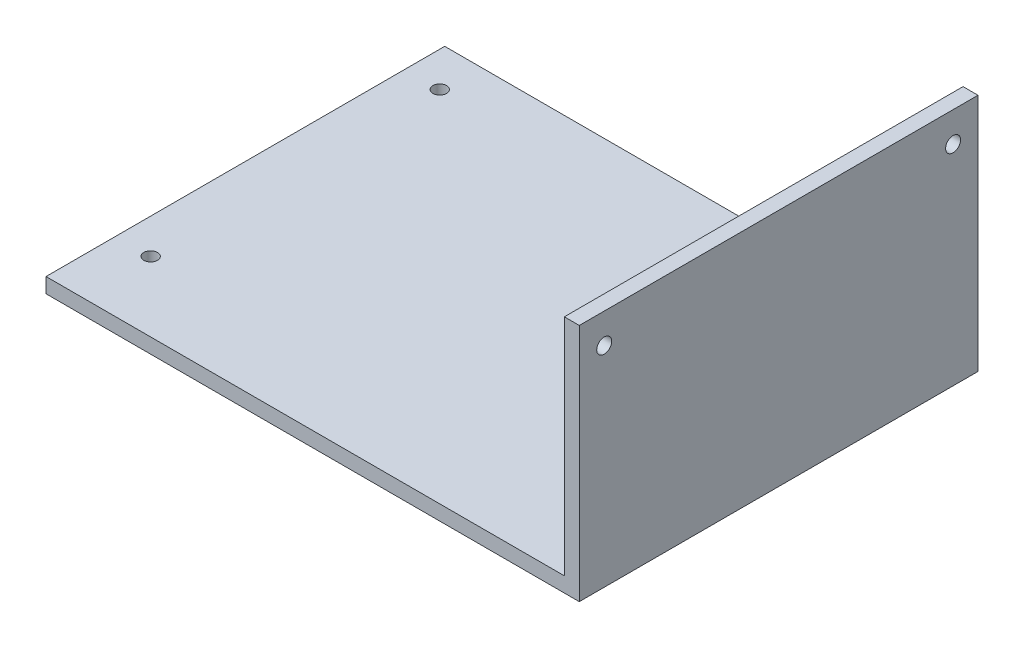
ISO-10303-21;
HEADER;
FILE_DESCRIPTION(('STEP AP214'),'2;1');
FILE_NAME('part.step','',(''),(''),'','','');
FILE_SCHEMA(('AUTOMOTIVE_DESIGN { 1 0 10303 214 1 1 1 1 }'));
ENDSEC;
DATA;
#1=APPLICATION_CONTEXT('core data for automotive mechanical design processes');
#2=APPLICATION_PROTOCOL_DEFINITION('international standard','automotive_design',2000,#1);
#3=PRODUCT_CONTEXT('',#1,'mechanical');
#4=PRODUCT('Part','Part','',(#3));
#5=PRODUCT_RELATED_PRODUCT_CATEGORY('part','',(#4));
#6=PRODUCT_DEFINITION_FORMATION('','',#4);
#7=PRODUCT_DEFINITION_CONTEXT('part definition',#1,'design');
#8=PRODUCT_DEFINITION('design','',#6,#7);
#9=PRODUCT_DEFINITION_SHAPE('','',#8);
#10=(LENGTH_UNIT() NAMED_UNIT(*) SI_UNIT(.MILLI.,.METRE.));
#11=(NAMED_UNIT(*) PLANE_ANGLE_UNIT() SI_UNIT($,.RADIAN.));
#12=(NAMED_UNIT(*) SI_UNIT($,.STERADIAN.) SOLID_ANGLE_UNIT());
#13=UNCERTAINTY_MEASURE_WITH_UNIT(LENGTH_MEASURE(1.E-05),#10,'distance_accuracy_value','');
#14=(GEOMETRIC_REPRESENTATION_CONTEXT(3) GLOBAL_UNCERTAINTY_ASSIGNED_CONTEXT((#13)) GLOBAL_UNIT_ASSIGNED_CONTEXT((#10,
#11,#12)) REPRESENTATION_CONTEXT('',''));
#15=CARTESIAN_POINT('',(0.,0.,0.));
#16=DIRECTION('',(0.,0.,1.));
#17=DIRECTION('',(1.,0.,0.));
#18=AXIS2_PLACEMENT_3D('',#15,#16,#17);
#19=CARTESIAN_POINT('',(0.,3.,0.));
#20=DIRECTION('',(0.,1.,0.));
#21=DIRECTION('',(0.,0.,1.));
#22=AXIS2_PLACEMENT_3D('',#19,#20,#21);
#23=PLANE('',#22);
#24=CARTESIAN_POINT('',(91.,3.,-69.));
#25=DIRECTION('',(0.,1.,0.));
#26=DIRECTION('',(0.,0.,1.));
#27=AXIS2_PLACEMENT_3D('',#24,#25,#26);
#28=CIRCLE('',#27,1.375);
#29=CARTESIAN_POINT('',(91.,3.,-67.625));
#30=VERTEX_POINT('',#29);
#31=EDGE_CURVE('E161',#30,#30,#28,.T.);
#32=ORIENTED_EDGE('',*,*,#31,.F.);
#33=EDGE_LOOP('',(#32));
#34=FACE_BOUND('',#33,.T.);
#35=CARTESIAN_POINT('',(5.00000000000001,3.,-11.));
#36=DIRECTION('',(0.,1.,0.));
#37=DIRECTION('',(0.,0.,1.));
#38=AXIS2_PLACEMENT_3D('',#35,#36,#37);
#39=CIRCLE('',#38,1.375);
#40=CARTESIAN_POINT('',(5.00000000000001,3.,-9.625));
#41=VERTEX_POINT('',#40);
#42=EDGE_CURVE('E174',#41,#41,#39,.T.);
#43=ORIENTED_EDGE('',*,*,#42,.F.);
#44=EDGE_LOOP('',(#43));
#45=FACE_BOUND('',#44,.T.);
#46=CARTESIAN_POINT('',(5.,3.,-69.));
#47=DIRECTION('',(0.,1.,0.));
#48=DIRECTION('',(0.,0.,1.));
#49=AXIS2_PLACEMENT_3D('',#46,#47,#48);
#50=CIRCLE('',#49,1.375);
#51=CARTESIAN_POINT('',(5.,3.,-67.625));
#52=VERTEX_POINT('',#51);
#53=EDGE_CURVE('E169',#52,#52,#50,.T.);
#54=ORIENTED_EDGE('',*,*,#53,.F.);
#55=EDGE_LOOP('',(#54));
#56=FACE_BOUND('',#55,.T.);
#57=CARTESIAN_POINT('',(91.,3.,-11.));
#58=DIRECTION('',(0.,1.,0.));
#59=DIRECTION('',(0.,0.,1.));
#60=AXIS2_PLACEMENT_3D('',#57,#58,#59);
#61=CIRCLE('',#60,1.375);
#62=CARTESIAN_POINT('',(91.,3.,-9.625));
#63=VERTEX_POINT('',#62);
#64=EDGE_CURVE('E160',#63,#63,#61,.T.);
#65=ORIENTED_EDGE('',*,*,#64,.F.);
#66=EDGE_LOOP('',(#65));
#67=FACE_BOUND('',#66,.T.);
#68=DIRECTION('',(1.,0.,0.));
#69=VECTOR('',#68,1.);
#70=CARTESIAN_POINT('',(-4.99999999999999,3.,3.));
#71=LINE('',#70,#69);
#72=CARTESIAN_POINT('',(-1.99999999999999,3.,3.));
#73=VERTEX_POINT('',#72);
#74=CARTESIAN_POINT('',(102.,3.,3.));
#75=VERTEX_POINT('',#74);
#76=EDGE_CURVE('E57',#73,#75,#71,.T.);
#77=ORIENTED_EDGE('',*,*,#76,.T.);
#78=DIRECTION('',(0.,0.,1.));
#79=VECTOR('',#78,1.);
#80=CARTESIAN_POINT('',(102.,3.,-77.));
#81=LINE('',#80,#79);
#82=CARTESIAN_POINT('',(102.,3.,-77.));
#83=VERTEX_POINT('',#82);
#84=EDGE_CURVE('E126',#83,#75,#81,.T.);
#85=ORIENTED_EDGE('',*,*,#84,.F.);
#86=DIRECTION('',(-1.,0.,0.));
#87=VECTOR('',#86,1.);
#88=CARTESIAN_POINT('',(105.,3.,-77.));
#89=LINE('',#88,#87);
#90=CARTESIAN_POINT('',(-1.99999999999999,3.,-77.));
#91=VERTEX_POINT('',#90);
#92=EDGE_CURVE('E120',#83,#91,#89,.T.);
#93=ORIENTED_EDGE('',*,*,#92,.T.);
#94=DIRECTION('',(0.,0.,-1.));
#95=VECTOR('',#94,1.);
#96=CARTESIAN_POINT('',(-1.99999999999999,3.,3.));
#97=LINE('',#96,#95);
#98=EDGE_CURVE('E99',#73,#91,#97,.T.);
#99=ORIENTED_EDGE('',*,*,#98,.F.);
#100=EDGE_LOOP('',(#77,#85,#93,#99));
#101=FACE_BOUND('',#100,.T.);
#102=ADVANCED_FACE('F39',(#34,#45,#56,#67,#101),#23,.T.);
#103=CARTESIAN_POINT('',(0.,0.,0.));
#104=DIRECTION('',(0.,1.,0.));
#105=DIRECTION('',(0.,0.,1.));
#106=AXIS2_PLACEMENT_3D('',#103,#104,#105);
#107=PLANE('',#106);
#108=DIRECTION('',(1.,0.,0.));
#109=VECTOR('',#108,1.);
#110=CARTESIAN_POINT('',(-4.99999999999999,0.,3.));
#111=LINE('',#110,#109);
#112=CARTESIAN_POINT('',(-1.99999999999999,0.,3.));
#113=VERTEX_POINT('',#112);
#114=CARTESIAN_POINT('',(105.,0.,3.));
#115=VERTEX_POINT('',#114);
#116=EDGE_CURVE('E115',#113,#115,#111,.T.);
#117=ORIENTED_EDGE('',*,*,#116,.F.);
#118=DIRECTION('',(0.,0.,-1.));
#119=VECTOR('',#118,1.);
#120=CARTESIAN_POINT('',(-1.99999999999999,0.,3.));
#121=LINE('',#120,#119);
#122=CARTESIAN_POINT('',(-1.99999999999999,0.,-77.));
#123=VERTEX_POINT('',#122);
#124=EDGE_CURVE('E96',#113,#123,#121,.T.);
#125=ORIENTED_EDGE('',*,*,#124,.T.);
#126=DIRECTION('',(-1.,0.,0.));
#127=VECTOR('',#126,1.);
#128=CARTESIAN_POINT('',(105.,0.,-77.));
#129=LINE('',#128,#127);
#130=CARTESIAN_POINT('',(105.,0.,-77.));
#131=VERTEX_POINT('',#130);
#132=EDGE_CURVE('E111',#131,#123,#129,.T.);
#133=ORIENTED_EDGE('',*,*,#132,.F.);
#134=DIRECTION('',(0.,0.,-1.));
#135=VECTOR('',#134,1.);
#136=CARTESIAN_POINT('',(105.,0.,3.));
#137=LINE('',#136,#135);
#138=EDGE_CURVE('E61',#115,#131,#137,.T.);
#139=ORIENTED_EDGE('',*,*,#138,.F.);
#140=EDGE_LOOP('',(#117,#125,#133,#139));
#141=FACE_BOUND('',#140,.T.);
#142=CARTESIAN_POINT('',(5.00000000000001,0.,-11.));
#143=DIRECTION('',(0.,1.,0.));
#144=DIRECTION('',(0.,0.,1.));
#145=AXIS2_PLACEMENT_3D('',#142,#143,#144);
#146=CIRCLE('',#145,1.375);
#147=CARTESIAN_POINT('',(5.00000000000001,0.,-9.625));
#148=VERTEX_POINT('',#147);
#149=EDGE_CURVE('E175',#148,#148,#146,.T.);
#150=ORIENTED_EDGE('',*,*,#149,.T.);
#151=EDGE_LOOP('',(#150));
#152=FACE_BOUND('',#151,.T.);
#153=CARTESIAN_POINT('',(5.,0.,-69.));
#154=DIRECTION('',(0.,1.,0.));
#155=DIRECTION('',(0.,0.,1.));
#156=AXIS2_PLACEMENT_3D('',#153,#154,#155);
#157=CIRCLE('',#156,1.375);
#158=CARTESIAN_POINT('',(5.,0.,-67.625));
#159=VERTEX_POINT('',#158);
#160=EDGE_CURVE('E168',#159,#159,#157,.T.);
#161=ORIENTED_EDGE('',*,*,#160,.T.);
#162=EDGE_LOOP('',(#161));
#163=FACE_BOUND('',#162,.T.);
#164=CARTESIAN_POINT('',(91.,0.,-69.));
#165=DIRECTION('',(0.,1.,0.));
#166=DIRECTION('',(0.,0.,1.));
#167=AXIS2_PLACEMENT_3D('',#164,#165,#166);
#168=CIRCLE('',#167,1.375);
#169=CARTESIAN_POINT('',(91.,0.,-67.625));
#170=VERTEX_POINT('',#169);
#171=EDGE_CURVE('E159',#170,#170,#168,.T.);
#172=ORIENTED_EDGE('',*,*,#171,.T.);
#173=EDGE_LOOP('',(#172));
#174=FACE_BOUND('',#173,.T.);
#175=CARTESIAN_POINT('',(91.,0.,-11.));
#176=DIRECTION('',(0.,1.,0.));
#177=DIRECTION('',(0.,0.,1.));
#178=AXIS2_PLACEMENT_3D('',#175,#176,#177);
#179=CIRCLE('',#178,1.375);
#180=CARTESIAN_POINT('',(91.,0.,-9.625));
#181=VERTEX_POINT('',#180);
#182=EDGE_CURVE('E156',#181,#181,#179,.T.);
#183=ORIENTED_EDGE('',*,*,#182,.T.);
#184=EDGE_LOOP('',(#183));
#185=FACE_BOUND('',#184,.T.);
#186=ADVANCED_FACE('F107',(#141,#152,#163,#174,#185),#107,.F.);
#187=CARTESIAN_POINT('',(-4.99999999999999,3.,3.));
#188=DIRECTION('',(0.,0.,-1.));
#189=DIRECTION('',(-1.,0.,0.));
#190=AXIS2_PLACEMENT_3D('',#187,#188,#189);
#191=PLANE('',#190);
#192=ORIENTED_EDGE('',*,*,#76,.F.);
#193=DIRECTION('',(0.,1.,0.));
#194=VECTOR('',#193,1.);
#195=CARTESIAN_POINT('',(-1.99999999999999,0.,3.));
#196=LINE('',#195,#194);
#197=EDGE_CURVE('E104',#113,#73,#196,.T.);
#198=ORIENTED_EDGE('',*,*,#197,.F.);
#199=ORIENTED_EDGE('',*,*,#116,.T.);
#200=DIRECTION('',(0.,-1.,0.));
#201=VECTOR('',#200,1.);
#202=CARTESIAN_POINT('',(105.,3.,3.));
#203=LINE('',#202,#201);
#204=CARTESIAN_POINT('',(105.,48.,3.));
#205=VERTEX_POINT('',#204);
#206=EDGE_CURVE('E11',#205,#115,#203,.T.);
#207=ORIENTED_EDGE('',*,*,#206,.F.);
#208=DIRECTION('',(1.,0.,0.));
#209=VECTOR('',#208,1.);
#210=CARTESIAN_POINT('',(105.,48.,3.));
#211=LINE('',#210,#209);
#212=CARTESIAN_POINT('',(102.,48.,3.));
#213=VERTEX_POINT('',#212);
#214=EDGE_CURVE('E143',#213,#205,#211,.T.);
#215=ORIENTED_EDGE('',*,*,#214,.F.);
#216=DIRECTION('',(0.,-1.,0.));
#217=VECTOR('',#216,1.);
#218=CARTESIAN_POINT('',(102.,48.,3.));
#219=LINE('',#218,#217);
#220=EDGE_CURVE('E146',#213,#75,#219,.T.);
#221=ORIENTED_EDGE('',*,*,#220,.T.);
#222=EDGE_LOOP('',(#192,#198,#199,#207,#215,#221));
#223=FACE_BOUND('',#222,.T.);
#224=ADVANCED_FACE('F41',(#223),#191,.F.);
#225=CARTESIAN_POINT('',(105.,3.,3.));
#226=DIRECTION('',(-1.,0.,0.));
#227=DIRECTION('',(0.,0.,1.));
#228=AXIS2_PLACEMENT_3D('',#225,#226,#227);
#229=PLANE('',#228);
#230=CARTESIAN_POINT('',(105.,42.,-72.));
#231=DIRECTION('',(-1.,0.,0.));
#232=DIRECTION('',(0.,0.,1.));
#233=AXIS2_PLACEMENT_3D('',#230,#231,#232);
#234=CIRCLE('',#233,1.5);
#235=CARTESIAN_POINT('',(105.,42.,-70.5));
#236=VERTEX_POINT('',#235);
#237=EDGE_CURVE('E121',#236,#236,#234,.T.);
#238=ORIENTED_EDGE('',*,*,#237,.T.);
#239=EDGE_LOOP('',(#238));
#240=FACE_BOUND('',#239,.T.);
#241=CARTESIAN_POINT('',(105.,42.,-2.));
#242=DIRECTION('',(-1.,0.,0.));
#243=DIRECTION('',(0.,0.,1.));
#244=AXIS2_PLACEMENT_3D('',#241,#242,#243);
#245=CIRCLE('',#244,1.5);
#246=CARTESIAN_POINT('',(105.,42.,-0.499999999999993));
#247=VERTEX_POINT('',#246);
#248=EDGE_CURVE('E129',#247,#247,#245,.T.);
#249=ORIENTED_EDGE('',*,*,#248,.T.);
#250=EDGE_LOOP('',(#249));
#251=FACE_BOUND('',#250,.T.);
#252=ORIENTED_EDGE('',*,*,#138,.T.);
#253=DIRECTION('',(0.,-1.,0.));
#254=VECTOR('',#253,1.);
#255=CARTESIAN_POINT('',(105.,3.,-77.));
#256=LINE('',#255,#254);
#257=CARTESIAN_POINT('',(105.,48.,-77.));
#258=VERTEX_POINT('',#257);
#259=EDGE_CURVE('E48',#258,#131,#256,.T.);
#260=ORIENTED_EDGE('',*,*,#259,.F.);
#261=DIRECTION('',(0.,0.,-1.));
#262=VECTOR('',#261,1.);
#263=CARTESIAN_POINT('',(105.,48.,-77.));
#264=LINE('',#263,#262);
#265=EDGE_CURVE('E137',#205,#258,#264,.T.);
#266=ORIENTED_EDGE('',*,*,#265,.F.);
#267=ORIENTED_EDGE('',*,*,#206,.T.);
#268=EDGE_LOOP('',(#252,#260,#266,#267));
#269=FACE_BOUND('',#268,.T.);
#270=ADVANCED_FACE('F182',(#240,#251,#269),#229,.F.);
#271=CARTESIAN_POINT('',(105.,3.,-77.));
#272=DIRECTION('',(0.,0.,1.));
#273=DIRECTION('',(1.,0.,0.));
#274=AXIS2_PLACEMENT_3D('',#271,#272,#273);
#275=PLANE('',#274);
#276=ORIENTED_EDGE('',*,*,#132,.T.);
#277=DIRECTION('',(0.,1.,0.));
#278=VECTOR('',#277,1.);
#279=CARTESIAN_POINT('',(-1.99999999999999,0.,-77.));
#280=LINE('',#279,#278);
#281=EDGE_CURVE('E94',#123,#91,#280,.T.);
#282=ORIENTED_EDGE('',*,*,#281,.T.);
#283=ORIENTED_EDGE('',*,*,#92,.F.);
#284=DIRECTION('',(0.,-1.,0.));
#285=VECTOR('',#284,1.);
#286=CARTESIAN_POINT('',(102.,48.,-77.));
#287=LINE('',#286,#285);
#288=CARTESIAN_POINT('',(102.,48.,-77.));
#289=VERTEX_POINT('',#288);
#290=EDGE_CURVE('E154',#289,#83,#287,.T.);
#291=ORIENTED_EDGE('',*,*,#290,.F.);
#292=DIRECTION('',(-1.,0.,0.));
#293=VECTOR('',#292,1.);
#294=CARTESIAN_POINT('',(105.,48.,-77.));
#295=LINE('',#294,#293);
#296=EDGE_CURVE('E142',#258,#289,#295,.T.);
#297=ORIENTED_EDGE('',*,*,#296,.F.);
#298=ORIENTED_EDGE('',*,*,#259,.T.);
#299=EDGE_LOOP('',(#276,#282,#283,#291,#297,#298));
#300=FACE_BOUND('',#299,.T.);
#301=ADVANCED_FACE('F112',(#300),#275,.F.);
#302=CARTESIAN_POINT('',(5.00000000000001,3.,-11.));
#303=DIRECTION('',(0.,-1.,0.));
#304=DIRECTION('',(0.,0.,-1.));
#305=AXIS2_PLACEMENT_3D('',#302,#303,#304);
#306=CYLINDRICAL_SURFACE('',#305,1.375);
#307=ORIENTED_EDGE('',*,*,#42,.T.);
#308=EDGE_LOOP('',(#307));
#309=FACE_BOUND('',#308,.T.);
#310=ORIENTED_EDGE('',*,*,#149,.F.);
#311=EDGE_LOOP('',(#310));
#312=FACE_BOUND('',#311,.T.);
#313=ADVANCED_FACE('F205',(#309,#312),#306,.F.);
#314=CARTESIAN_POINT('',(5.,3.,-69.));
#315=DIRECTION('',(0.,-1.,0.));
#316=DIRECTION('',(0.,0.,-1.));
#317=AXIS2_PLACEMENT_3D('',#314,#315,#316);
#318=CYLINDRICAL_SURFACE('',#317,1.375);
#319=ORIENTED_EDGE('',*,*,#53,.T.);
#320=EDGE_LOOP('',(#319));
#321=FACE_BOUND('',#320,.T.);
#322=ORIENTED_EDGE('',*,*,#160,.F.);
#323=EDGE_LOOP('',(#322));
#324=FACE_BOUND('',#323,.T.);
#325=ADVANCED_FACE('F232',(#321,#324),#318,.F.);
#326=CARTESIAN_POINT('',(91.,3.,-69.));
#327=DIRECTION('',(0.,-1.,0.));
#328=DIRECTION('',(0.,0.,-1.));
#329=AXIS2_PLACEMENT_3D('',#326,#327,#328);
#330=CYLINDRICAL_SURFACE('',#329,1.375);
#331=ORIENTED_EDGE('',*,*,#31,.T.);
#332=EDGE_LOOP('',(#331));
#333=FACE_BOUND('',#332,.T.);
#334=ORIENTED_EDGE('',*,*,#171,.F.);
#335=EDGE_LOOP('',(#334));
#336=FACE_BOUND('',#335,.T.);
#337=ADVANCED_FACE('F235',(#333,#336),#330,.F.);
#338=CARTESIAN_POINT('',(91.,3.,-11.));
#339=DIRECTION('',(0.,-1.,0.));
#340=DIRECTION('',(0.,0.,-1.));
#341=AXIS2_PLACEMENT_3D('',#338,#339,#340);
#342=CYLINDRICAL_SURFACE('',#341,1.375);
#343=ORIENTED_EDGE('',*,*,#64,.T.);
#344=EDGE_LOOP('',(#343));
#345=FACE_BOUND('',#344,.T.);
#346=ORIENTED_EDGE('',*,*,#182,.F.);
#347=EDGE_LOOP('',(#346));
#348=FACE_BOUND('',#347,.T.);
#349=ADVANCED_FACE('F226',(#345,#348),#342,.F.);
#350=CARTESIAN_POINT('',(102.,48.,-77.));
#351=DIRECTION('',(1.,0.,0.));
#352=DIRECTION('',(0.,0.,-1.));
#353=AXIS2_PLACEMENT_3D('',#350,#351,#352);
#354=PLANE('',#353);
#355=CARTESIAN_POINT('',(102.,42.,-72.));
#356=DIRECTION('',(1.,0.,0.));
#357=DIRECTION('',(0.,0.,-1.));
#358=AXIS2_PLACEMENT_3D('',#355,#356,#357);
#359=CIRCLE('',#358,1.5);
#360=CARTESIAN_POINT('',(102.,42.,-73.5));
#361=VERTEX_POINT('',#360);
#362=EDGE_CURVE('E43',#361,#361,#359,.T.);
#363=ORIENTED_EDGE('',*,*,#362,.T.);
#364=EDGE_LOOP('',(#363));
#365=FACE_BOUND('',#364,.T.);
#366=CARTESIAN_POINT('',(102.,42.,-2.));
#367=DIRECTION('',(1.,0.,0.));
#368=DIRECTION('',(0.,0.,-1.));
#369=AXIS2_PLACEMENT_3D('',#366,#367,#368);
#370=CIRCLE('',#369,1.5);
#371=CARTESIAN_POINT('',(102.,42.,-3.5));
#372=VERTEX_POINT('',#371);
#373=EDGE_CURVE('E125',#372,#372,#370,.T.);
#374=ORIENTED_EDGE('',*,*,#373,.T.);
#375=EDGE_LOOP('',(#374));
#376=FACE_BOUND('',#375,.T.);
#377=ORIENTED_EDGE('',*,*,#84,.T.);
#378=ORIENTED_EDGE('',*,*,#220,.F.);
#379=DIRECTION('',(0.,0.,1.));
#380=VECTOR('',#379,1.);
#381=CARTESIAN_POINT('',(102.,48.,-77.));
#382=LINE('',#381,#380);
#383=EDGE_CURVE('E141',#289,#213,#382,.T.);
#384=ORIENTED_EDGE('',*,*,#383,.F.);
#385=ORIENTED_EDGE('',*,*,#290,.T.);
#386=EDGE_LOOP('',(#377,#378,#384,#385));
#387=FACE_BOUND('',#386,.T.);
#388=ADVANCED_FACE('F188',(#365,#376,#387),#354,.F.);
#389=CARTESIAN_POINT('',(0.,48.,0.));
#390=DIRECTION('',(0.,-1.,0.));
#391=DIRECTION('',(0.,0.,-1.));
#392=AXIS2_PLACEMENT_3D('',#389,#390,#391);
#393=PLANE('',#392);
#394=ORIENTED_EDGE('',*,*,#265,.T.);
#395=ORIENTED_EDGE('',*,*,#296,.T.);
#396=ORIENTED_EDGE('',*,*,#383,.T.);
#397=ORIENTED_EDGE('',*,*,#214,.T.);
#398=EDGE_LOOP('',(#394,#395,#396,#397));
#399=FACE_BOUND('',#398,.T.);
#400=ADVANCED_FACE('F184',(#399),#393,.F.);
#401=CARTESIAN_POINT('',(105.,42.,-2.));
#402=DIRECTION('',(-1.,0.,0.));
#403=DIRECTION('',(0.,0.,1.));
#404=AXIS2_PLACEMENT_3D('',#401,#402,#403);
#405=CYLINDRICAL_SURFACE('',#404,1.5);
#406=ORIENTED_EDGE('',*,*,#248,.F.);
#407=EDGE_LOOP('',(#406));
#408=FACE_BOUND('',#407,.T.);
#409=ORIENTED_EDGE('',*,*,#373,.F.);
#410=EDGE_LOOP('',(#409));
#411=FACE_BOUND('',#410,.T.);
#412=ADVANCED_FACE('F214',(#408,#411),#405,.F.);
#413=CARTESIAN_POINT('',(105.,42.,-72.));
#414=DIRECTION('',(-1.,0.,0.));
#415=DIRECTION('',(0.,0.,1.));
#416=AXIS2_PLACEMENT_3D('',#413,#414,#415);
#417=CYLINDRICAL_SURFACE('',#416,1.5);
#418=ORIENTED_EDGE('',*,*,#237,.F.);
#419=EDGE_LOOP('',(#418));
#420=FACE_BOUND('',#419,.T.);
#421=ORIENTED_EDGE('',*,*,#362,.F.);
#422=EDGE_LOOP('',(#421));
#423=FACE_BOUND('',#422,.T.);
#424=ADVANCED_FACE('F220',(#420,#423),#417,.F.);
#425=CARTESIAN_POINT('',(-1.99999999999999,0.,3.));
#426=DIRECTION('',(1.,0.,0.));
#427=DIRECTION('',(0.,0.,-1.));
#428=AXIS2_PLACEMENT_3D('',#425,#426,#427);
#429=PLANE('',#428);
#430=ORIENTED_EDGE('',*,*,#98,.T.);
#431=ORIENTED_EDGE('',*,*,#281,.F.);
#432=ORIENTED_EDGE('',*,*,#124,.F.);
#433=ORIENTED_EDGE('',*,*,#197,.T.);
#434=EDGE_LOOP('',(#430,#431,#432,#433));
#435=FACE_BOUND('',#434,.T.);
#436=ADVANCED_FACE('F97',(#435),#429,.F.);
#437=CLOSED_SHELL('',(#102,#186,#224,#270,#301,#313,#325,#337,#349,#388,#400,#412,#424,#436));
#438=MANIFOLD_SOLID_BREP('B2',#437);
#439=ADVANCED_BREP_SHAPE_REPRESENTATION('',(#18,#438),#14);
#440=SHAPE_DEFINITION_REPRESENTATION(#9,#439);
ENDSEC;
END-ISO-10303-21;
